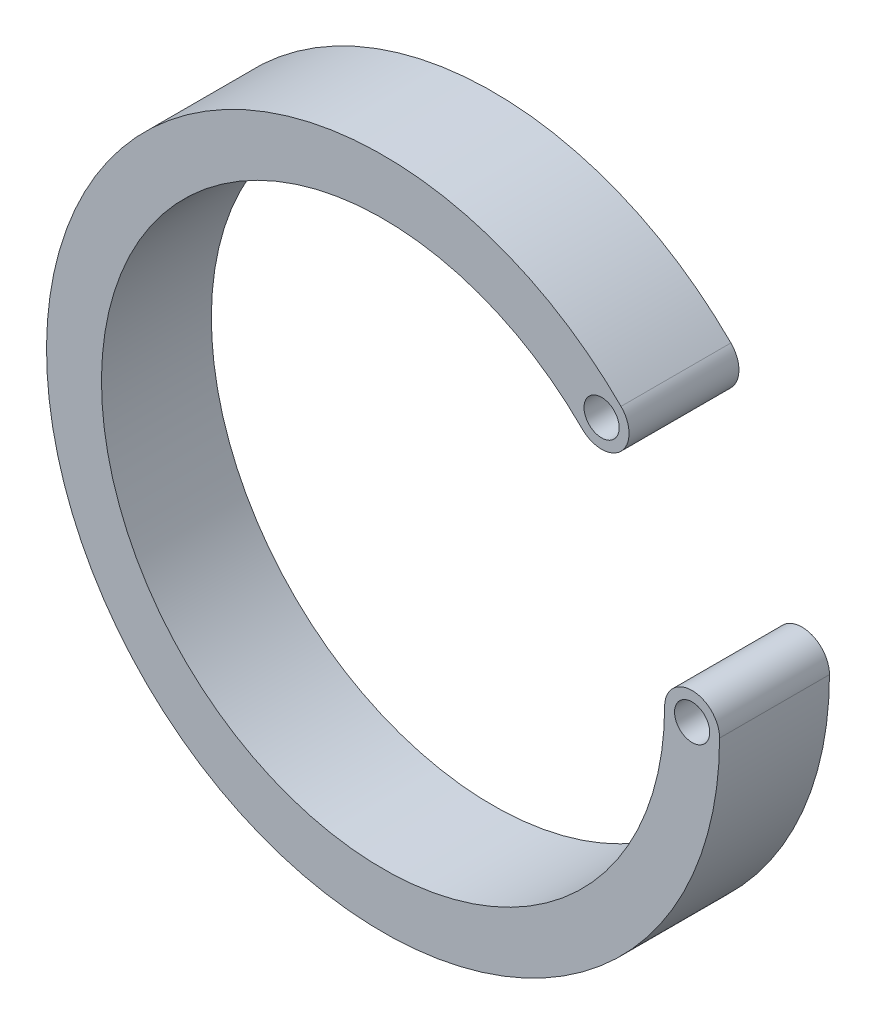
ISO-10303-21;
HEADER;
FILE_DESCRIPTION(('STEP AP214'),'2;1');
FILE_NAME('part.step','',(''),(''),'','','');
FILE_SCHEMA(('AUTOMOTIVE_DESIGN { 1 0 10303 214 1 1 1 1 }'));
ENDSEC;
DATA;
#1=APPLICATION_CONTEXT('core data for automotive mechanical design processes');
#2=APPLICATION_PROTOCOL_DEFINITION('international standard','automotive_design',2000,#1);
#3=PRODUCT_CONTEXT('',#1,'mechanical');
#4=PRODUCT('Part','Part','',(#3));
#5=PRODUCT_RELATED_PRODUCT_CATEGORY('part','',(#4));
#6=PRODUCT_DEFINITION_FORMATION('','',#4);
#7=PRODUCT_DEFINITION_CONTEXT('part definition',#1,'design');
#8=PRODUCT_DEFINITION('design','',#6,#7);
#9=PRODUCT_DEFINITION_SHAPE('','',#8);
#10=(LENGTH_UNIT() NAMED_UNIT(*) SI_UNIT(.MILLI.,.METRE.));
#11=(NAMED_UNIT(*) PLANE_ANGLE_UNIT() SI_UNIT($,.RADIAN.));
#12=(NAMED_UNIT(*) SI_UNIT($,.STERADIAN.) SOLID_ANGLE_UNIT());
#13=UNCERTAINTY_MEASURE_WITH_UNIT(LENGTH_MEASURE(1.E-05),#10,'distance_accuracy_value','');
#14=(GEOMETRIC_REPRESENTATION_CONTEXT(3) GLOBAL_UNCERTAINTY_ASSIGNED_CONTEXT((#13)) GLOBAL_UNIT_ASSIGNED_CONTEXT((#10,
#11,#12)) REPRESENTATION_CONTEXT('',''));
#15=CARTESIAN_POINT('',(0.,0.,0.));
#16=DIRECTION('',(0.,0.,1.));
#17=DIRECTION('',(1.,0.,0.));
#18=AXIS2_PLACEMENT_3D('',#15,#16,#17);
#19=CARTESIAN_POINT('',(25.2569703405069,25.256970340507,12.7));
#20=DIRECTION('',(0.,0.,-1.));
#21=DIRECTION('',(-1.,0.,0.));
#22=AXIS2_PLACEMENT_3D('',#19,#20,#21);
#23=CYLINDRICAL_SURFACE('',#22,3.175);
#24=CARTESIAN_POINT('',(25.2569703405069,25.256970340507,0.));
#25=DIRECTION('',(0.,0.,1.));
#26=DIRECTION('',(1.,0.,0.));
#27=AXIS2_PLACEMENT_3D('',#24,#25,#26);
#28=CIRCLE('',#27,3.175);
#29=CARTESIAN_POINT('',(27.5020343707742,27.5020343707743,0.));
#30=VERTEX_POINT('',#29);
#31=CARTESIAN_POINT('',(23.0119063102397,23.0119063102397,0.));
#32=VERTEX_POINT('',#31);
#33=EDGE_CURVE('E128',#30,#32,#28,.F.);
#34=ORIENTED_EDGE('',*,*,#33,.F.);
#35=DIRECTION('',(0.,0.,-1.));
#36=VECTOR('',#35,1.);
#37=CARTESIAN_POINT('',(27.5020343707742,27.5020343707743,12.7));
#38=LINE('',#37,#36);
#39=CARTESIAN_POINT('',(27.5020343707742,27.5020343707743,12.7));
#40=VERTEX_POINT('',#39);
#41=EDGE_CURVE('E11',#40,#30,#38,.T.);
#42=ORIENTED_EDGE('',*,*,#41,.F.);
#43=CARTESIAN_POINT('',(25.2569703405069,25.256970340507,12.7));
#44=DIRECTION('',(0.,0.,1.));
#45=DIRECTION('',(1.,0.,0.));
#46=AXIS2_PLACEMENT_3D('',#43,#44,#45);
#47=CIRCLE('',#46,3.175);
#48=CARTESIAN_POINT('',(23.0119063102397,23.0119063102397,12.7));
#49=VERTEX_POINT('',#48);
#50=EDGE_CURVE('E103',#40,#49,#47,.F.);
#51=ORIENTED_EDGE('',*,*,#50,.T.);
#52=DIRECTION('',(0.,0.,-1.));
#53=VECTOR('',#52,1.);
#54=CARTESIAN_POINT('',(23.0119063102397,23.0119063102397,12.7));
#55=LINE('',#54,#53);
#56=EDGE_CURVE('E69',#49,#32,#55,.T.);
#57=ORIENTED_EDGE('',*,*,#56,.T.);
#58=EDGE_LOOP('',(#34,#42,#51,#57));
#59=FACE_BOUND('',#58,.T.);
#60=ADVANCED_FACE('F50',(#59),#23,.T.);
#61=CARTESIAN_POINT('',(0.,0.,12.7));
#62=DIRECTION('',(0.,0.,-1.));
#63=DIRECTION('',(-1.,0.,0.));
#64=AXIS2_PLACEMENT_3D('',#61,#62,#63);
#65=CYLINDRICAL_SURFACE('',#64,38.89375);
#66=CARTESIAN_POINT('',(0.,0.,0.));
#67=DIRECTION('',(0.,0.,1.));
#68=DIRECTION('',(1.,0.,0.));
#69=AXIS2_PLACEMENT_3D('',#66,#67,#68);
#70=CIRCLE('',#69,38.89375);
#71=CARTESIAN_POINT('',(38.89375,0.,0.));
#72=VERTEX_POINT('',#71);
#73=EDGE_CURVE('E109',#30,#72,#70,.T.);
#74=ORIENTED_EDGE('',*,*,#73,.T.);
#75=DIRECTION('',(0.,0.,-1.));
#76=VECTOR('',#75,1.);
#77=CARTESIAN_POINT('',(38.89375,0.,12.7));
#78=LINE('',#77,#76);
#79=CARTESIAN_POINT('',(38.89375,0.,12.7));
#80=VERTEX_POINT('',#79);
#81=EDGE_CURVE('E60',#80,#72,#78,.T.);
#82=ORIENTED_EDGE('',*,*,#81,.F.);
#83=CARTESIAN_POINT('',(0.,0.,12.7));
#84=DIRECTION('',(0.,0.,1.));
#85=DIRECTION('',(1.,0.,0.));
#86=AXIS2_PLACEMENT_3D('',#83,#84,#85);
#87=CIRCLE('',#86,38.89375);
#88=EDGE_CURVE('E100',#40,#80,#87,.T.);
#89=ORIENTED_EDGE('',*,*,#88,.F.);
#90=ORIENTED_EDGE('',*,*,#41,.T.);
#91=EDGE_LOOP('',(#74,#82,#89,#90));
#92=FACE_BOUND('',#91,.T.);
#93=ADVANCED_FACE('F107',(#92),#65,.T.);
#94=CARTESIAN_POINT('',(35.71875,0.,12.7));
#95=DIRECTION('',(0.,0.,-1.));
#96=DIRECTION('',(-1.,0.,0.));
#97=AXIS2_PLACEMENT_3D('',#94,#95,#96);
#98=CYLINDRICAL_SURFACE('',#97,3.175);
#99=CARTESIAN_POINT('',(35.71875,0.,0.));
#100=DIRECTION('',(0.,0.,1.));
#101=DIRECTION('',(1.,0.,0.));
#102=AXIS2_PLACEMENT_3D('',#99,#100,#101);
#103=CIRCLE('',#102,3.175);
#104=CARTESIAN_POINT('',(32.54375,0.,0.));
#105=VERTEX_POINT('',#104);
#106=EDGE_CURVE('E133',#105,#72,#103,.F.);
#107=ORIENTED_EDGE('',*,*,#106,.F.);
#108=DIRECTION('',(0.,0.,-1.));
#109=VECTOR('',#108,1.);
#110=CARTESIAN_POINT('',(32.54375,0.,12.7));
#111=LINE('',#110,#109);
#112=CARTESIAN_POINT('',(32.54375,0.,12.7));
#113=VERTEX_POINT('',#112);
#114=EDGE_CURVE('E81',#113,#105,#111,.T.);
#115=ORIENTED_EDGE('',*,*,#114,.F.);
#116=CARTESIAN_POINT('',(35.71875,0.,12.7));
#117=DIRECTION('',(0.,0.,1.));
#118=DIRECTION('',(1.,0.,0.));
#119=AXIS2_PLACEMENT_3D('',#116,#117,#118);
#120=CIRCLE('',#119,3.175);
#121=EDGE_CURVE('E105',#113,#80,#120,.F.);
#122=ORIENTED_EDGE('',*,*,#121,.T.);
#123=ORIENTED_EDGE('',*,*,#81,.T.);
#124=EDGE_LOOP('',(#107,#115,#122,#123));
#125=FACE_BOUND('',#124,.T.);
#126=ADVANCED_FACE('F114',(#125),#98,.T.);
#127=CARTESIAN_POINT('',(35.71875,0.,12.7));
#128=DIRECTION('',(0.,0.,-1.));
#129=DIRECTION('',(-1.,0.,0.));
#130=AXIS2_PLACEMENT_3D('',#127,#128,#129);
#131=CYLINDRICAL_SURFACE('',#130,2.032);
#132=CARTESIAN_POINT('',(35.71875,0.,12.7));
#133=DIRECTION('',(0.,0.,1.));
#134=DIRECTION('',(1.,0.,0.));
#135=AXIS2_PLACEMENT_3D('',#132,#133,#134);
#136=CIRCLE('',#135,2.032);
#137=CARTESIAN_POINT('',(37.75075,0.,12.7));
#138=VERTEX_POINT('',#137);
#139=EDGE_CURVE('E148',#138,#138,#136,.T.);
#140=ORIENTED_EDGE('',*,*,#139,.T.);
#141=EDGE_LOOP('',(#140));
#142=FACE_BOUND('',#141,.T.);
#143=CARTESIAN_POINT('',(35.71875,0.,0.));
#144=DIRECTION('',(0.,0.,1.));
#145=DIRECTION('',(1.,0.,0.));
#146=AXIS2_PLACEMENT_3D('',#143,#144,#145);
#147=CIRCLE('',#146,2.032);
#148=CARTESIAN_POINT('',(37.75075,0.,0.));
#149=VERTEX_POINT('',#148);
#150=EDGE_CURVE('E130',#149,#149,#147,.T.);
#151=ORIENTED_EDGE('',*,*,#150,.F.);
#152=EDGE_LOOP('',(#151));
#153=FACE_BOUND('',#152,.T.);
#154=ADVANCED_FACE('F176',(#142,#153),#131,.F.);
#155=CARTESIAN_POINT('',(25.2569703405069,25.256970340507,12.7));
#156=DIRECTION('',(0.,0.,-1.));
#157=DIRECTION('',(-1.,0.,0.));
#158=AXIS2_PLACEMENT_3D('',#155,#156,#157);
#159=CYLINDRICAL_SURFACE('',#158,2.032);
#160=CARTESIAN_POINT('',(25.2569703405069,25.256970340507,12.7));
#161=DIRECTION('',(0.,0.,1.));
#162=DIRECTION('',(1.,0.,0.));
#163=AXIS2_PLACEMENT_3D('',#160,#161,#162);
#164=CIRCLE('',#163,2.032);
#165=CARTESIAN_POINT('',(27.2889703405069,25.256970340507,12.7));
#166=VERTEX_POINT('',#165);
#167=EDGE_CURVE('E142',#166,#166,#164,.T.);
#168=ORIENTED_EDGE('',*,*,#167,.T.);
#169=EDGE_LOOP('',(#168));
#170=FACE_BOUND('',#169,.T.);
#171=CARTESIAN_POINT('',(25.2569703405069,25.256970340507,0.));
#172=DIRECTION('',(0.,0.,1.));
#173=DIRECTION('',(1.,0.,0.));
#174=AXIS2_PLACEMENT_3D('',#171,#172,#173);
#175=CIRCLE('',#174,2.032);
#176=CARTESIAN_POINT('',(27.2889703405069,25.256970340507,0.));
#177=VERTEX_POINT('',#176);
#178=EDGE_CURVE('E124',#177,#177,#175,.T.);
#179=ORIENTED_EDGE('',*,*,#178,.F.);
#180=EDGE_LOOP('',(#179));
#181=FACE_BOUND('',#180,.T.);
#182=ADVANCED_FACE('F47',(#170,#181),#159,.F.);
#183=CARTESIAN_POINT('',(0.,0.,12.7));
#184=DIRECTION('',(0.,0.,-1.));
#185=DIRECTION('',(-1.,0.,0.));
#186=AXIS2_PLACEMENT_3D('',#183,#184,#185);
#187=CYLINDRICAL_SURFACE('',#186,32.54375);
#188=CARTESIAN_POINT('',(0.,0.,0.));
#189=DIRECTION('',(0.,0.,1.));
#190=DIRECTION('',(1.,0.,0.));
#191=AXIS2_PLACEMENT_3D('',#188,#189,#190);
#192=CIRCLE('',#191,32.54375);
#193=EDGE_CURVE('E139',#32,#105,#192,.T.);
#194=ORIENTED_EDGE('',*,*,#193,.F.);
#195=ORIENTED_EDGE('',*,*,#56,.F.);
#196=CARTESIAN_POINT('',(0.,0.,12.7));
#197=DIRECTION('',(0.,0.,1.));
#198=DIRECTION('',(1.,0.,0.));
#199=AXIS2_PLACEMENT_3D('',#196,#197,#198);
#200=CIRCLE('',#199,32.54375);
#201=EDGE_CURVE('E113',#49,#113,#200,.T.);
#202=ORIENTED_EDGE('',*,*,#201,.T.);
#203=ORIENTED_EDGE('',*,*,#114,.T.);
#204=EDGE_LOOP('',(#194,#195,#202,#203));
#205=FACE_BOUND('',#204,.T.);
#206=ADVANCED_FACE('F165',(#205),#187,.F.);
#207=CARTESIAN_POINT('',(0.,0.,12.7));
#208=DIRECTION('',(0.,0.,1.));
#209=DIRECTION('',(1.,0.,0.));
#210=AXIS2_PLACEMENT_3D('',#207,#208,#209);
#211=PLANE('',#210);
#212=ORIENTED_EDGE('',*,*,#167,.F.);
#213=EDGE_LOOP('',(#212));
#214=FACE_BOUND('',#213,.T.);
#215=ORIENTED_EDGE('',*,*,#139,.F.);
#216=EDGE_LOOP('',(#215));
#217=FACE_BOUND('',#216,.T.);
#218=ORIENTED_EDGE('',*,*,#50,.F.);
#219=ORIENTED_EDGE('',*,*,#88,.T.);
#220=ORIENTED_EDGE('',*,*,#121,.F.);
#221=ORIENTED_EDGE('',*,*,#201,.F.);
#222=EDGE_LOOP('',(#218,#219,#220,#221));
#223=FACE_BOUND('',#222,.T.);
#224=ADVANCED_FACE('F97',(#214,#217,#223),#211,.T.);
#225=CARTESIAN_POINT('',(0.,0.,0.));
#226=DIRECTION('',(0.,0.,1.));
#227=DIRECTION('',(1.,0.,0.));
#228=AXIS2_PLACEMENT_3D('',#225,#226,#227);
#229=PLANE('',#228);
#230=ORIENTED_EDGE('',*,*,#178,.T.);
#231=EDGE_LOOP('',(#230));
#232=FACE_BOUND('',#231,.T.);
#233=ORIENTED_EDGE('',*,*,#150,.T.);
#234=EDGE_LOOP('',(#233));
#235=FACE_BOUND('',#234,.T.);
#236=ORIENTED_EDGE('',*,*,#33,.T.);
#237=ORIENTED_EDGE('',*,*,#193,.T.);
#238=ORIENTED_EDGE('',*,*,#106,.T.);
#239=ORIENTED_EDGE('',*,*,#73,.F.);
#240=EDGE_LOOP('',(#236,#237,#238,#239));
#241=FACE_BOUND('',#240,.T.);
#242=ADVANCED_FACE('F161',(#232,#235,#241),#229,.F.);
#243=CLOSED_SHELL('',(#60,#93,#126,#154,#182,#206,#224,#242));
#244=MANIFOLD_SOLID_BREP('B2',#243);
#245=ADVANCED_BREP_SHAPE_REPRESENTATION('',(#18,#244),#14);
#246=SHAPE_DEFINITION_REPRESENTATION(#9,#245);
ENDSEC;
END-ISO-10303-21;
